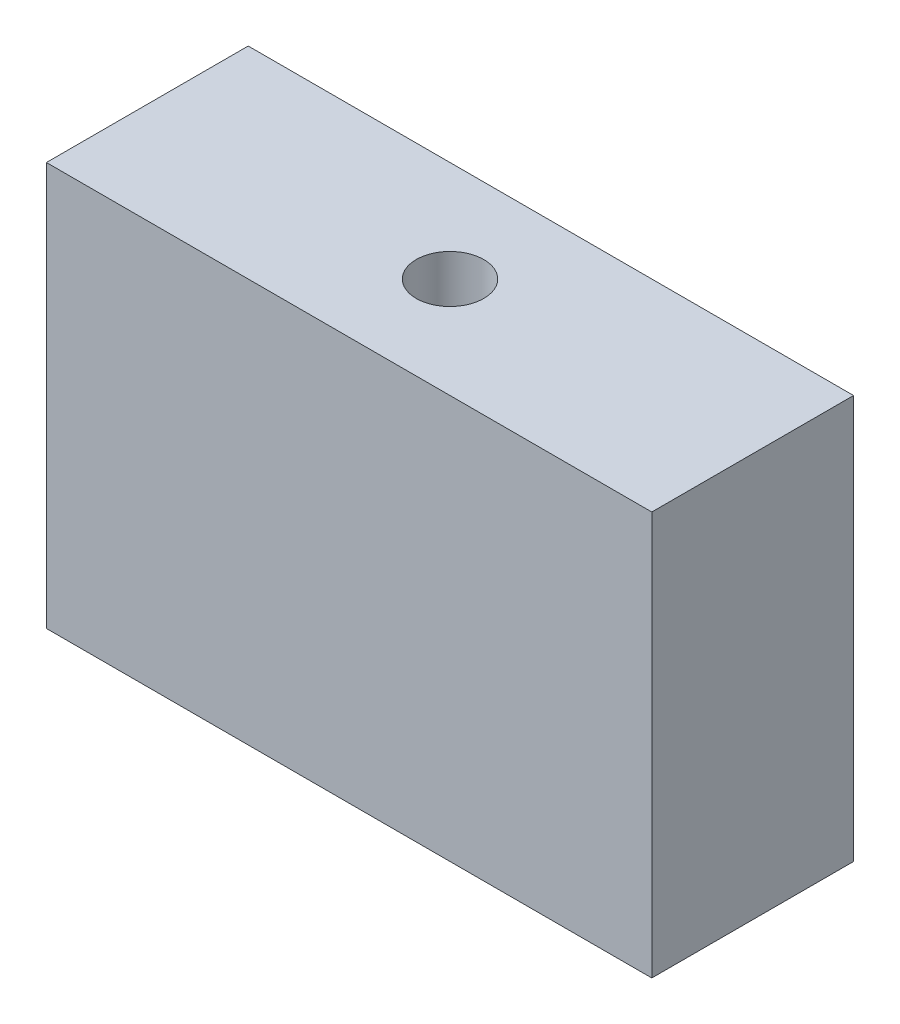
ISO-10303-21;
HEADER;
FILE_DESCRIPTION(('STEP AP214'),'2;1');
FILE_NAME('part.step','',(''),(''),'','','');
FILE_SCHEMA(('AUTOMOTIVE_DESIGN { 1 0 10303 214 1 1 1 1 }'));
ENDSEC;
DATA;
#1=APPLICATION_CONTEXT('core data for automotive mechanical design processes');
#2=APPLICATION_PROTOCOL_DEFINITION('international standard','automotive_design',2000,#1);
#3=PRODUCT_CONTEXT('',#1,'mechanical');
#4=PRODUCT('Part','Part','',(#3));
#5=PRODUCT_RELATED_PRODUCT_CATEGORY('part','',(#4));
#6=PRODUCT_DEFINITION_FORMATION('','',#4);
#7=PRODUCT_DEFINITION_CONTEXT('part definition',#1,'design');
#8=PRODUCT_DEFINITION('design','',#6,#7);
#9=PRODUCT_DEFINITION_SHAPE('','',#8);
#10=(LENGTH_UNIT() NAMED_UNIT(*) SI_UNIT(.MILLI.,.METRE.));
#11=(NAMED_UNIT(*) PLANE_ANGLE_UNIT() SI_UNIT($,.RADIAN.));
#12=(NAMED_UNIT(*) SI_UNIT($,.STERADIAN.) SOLID_ANGLE_UNIT());
#13=UNCERTAINTY_MEASURE_WITH_UNIT(LENGTH_MEASURE(1.E-05),#10,'distance_accuracy_value','');
#14=(GEOMETRIC_REPRESENTATION_CONTEXT(3) GLOBAL_UNCERTAINTY_ASSIGNED_CONTEXT((#13)) GLOBAL_UNIT_ASSIGNED_CONTEXT((#10,
#11,#12)) REPRESENTATION_CONTEXT('',''));
#15=CARTESIAN_POINT('',(0.,0.,0.));
#16=DIRECTION('',(0.,0.,1.));
#17=DIRECTION('',(1.,0.,0.));
#18=AXIS2_PLACEMENT_3D('',#15,#16,#17);
#19=CARTESIAN_POINT('',(0.,25.4,0.));
#20=DIRECTION('',(0.,1.,0.));
#21=DIRECTION('',(0.,0.,1.));
#22=AXIS2_PLACEMENT_3D('',#19,#20,#21);
#23=PLANE('',#22);
#24=DIRECTION('',(0.,0.,1.));
#25=VECTOR('',#24,1.);
#26=CARTESIAN_POINT('',(-38.1,25.4,12.7));
#27=LINE('',#26,#25);
#28=CARTESIAN_POINT('',(-38.1,25.4,-12.7));
#29=VERTEX_POINT('',#28);
#30=CARTESIAN_POINT('',(-38.1,25.4,12.7));
#31=VERTEX_POINT('',#30);
#32=EDGE_CURVE('E87',#29,#31,#27,.T.);
#33=ORIENTED_EDGE('',*,*,#32,.T.);
#34=DIRECTION('',(1.,0.,0.));
#35=VECTOR('',#34,1.);
#36=CARTESIAN_POINT('',(38.1,25.4,12.7));
#37=LINE('',#36,#35);
#38=CARTESIAN_POINT('',(38.1,25.4,12.7));
#39=VERTEX_POINT('',#38);
#40=EDGE_CURVE('E82',#31,#39,#37,.T.);
#41=ORIENTED_EDGE('',*,*,#40,.T.);
#42=DIRECTION('',(0.,0.,-1.));
#43=VECTOR('',#42,1.);
#44=CARTESIAN_POINT('',(38.1,25.4,12.7));
#45=LINE('',#44,#43);
#46=CARTESIAN_POINT('',(38.1,25.4,-12.7));
#47=VERTEX_POINT('',#46);
#48=EDGE_CURVE('E85',#39,#47,#45,.T.);
#49=ORIENTED_EDGE('',*,*,#48,.T.);
#50=DIRECTION('',(-1.,0.,0.));
#51=VECTOR('',#50,1.);
#52=CARTESIAN_POINT('',(38.1,25.4,-12.7));
#53=LINE('',#52,#51);
#54=EDGE_CURVE('E52',#47,#29,#53,.T.);
#55=ORIENTED_EDGE('',*,*,#54,.T.);
#56=EDGE_LOOP('',(#33,#41,#49,#55));
#57=FACE_BOUND('',#56,.T.);
#58=CARTESIAN_POINT('',(0.,25.4,0.));
#59=DIRECTION('',(0.,1.,0.));
#60=DIRECTION('',(0.,0.,1.));
#61=AXIS2_PLACEMENT_3D('',#58,#59,#60);
#62=CIRCLE('',#61,4.25);
#63=CARTESIAN_POINT('',(0.,25.4,4.24999999999999));
#64=VERTEX_POINT('',#63);
#65=EDGE_CURVE('E102',#64,#64,#62,.T.);
#66=ORIENTED_EDGE('',*,*,#65,.F.);
#67=EDGE_LOOP('',(#66));
#68=FACE_BOUND('',#67,.T.);
#69=ADVANCED_FACE('F35',(#57,#68),#23,.T.);
#70=CARTESIAN_POINT('',(0.,-25.4,0.));
#71=DIRECTION('',(0.,1.,0.));
#72=DIRECTION('',(0.,0.,1.));
#73=AXIS2_PLACEMENT_3D('',#70,#71,#72);
#74=PLANE('',#73);
#75=DIRECTION('',(0.,0.,1.));
#76=VECTOR('',#75,1.);
#77=CARTESIAN_POINT('',(-38.1,-25.4,12.7));
#78=LINE('',#77,#76);
#79=CARTESIAN_POINT('',(-38.1,-25.4,-12.7));
#80=VERTEX_POINT('',#79);
#81=CARTESIAN_POINT('',(-38.1,-25.4,12.7));
#82=VERTEX_POINT('',#81);
#83=EDGE_CURVE('E99',#80,#82,#78,.T.);
#84=ORIENTED_EDGE('',*,*,#83,.F.);
#85=DIRECTION('',(-1.,0.,0.));
#86=VECTOR('',#85,1.);
#87=CARTESIAN_POINT('',(38.1,-25.4,-12.7));
#88=LINE('',#87,#86);
#89=CARTESIAN_POINT('',(38.1,-25.4,-12.7));
#90=VERTEX_POINT('',#89);
#91=EDGE_CURVE('E75',#90,#80,#88,.T.);
#92=ORIENTED_EDGE('',*,*,#91,.F.);
#93=DIRECTION('',(0.,0.,-1.));
#94=VECTOR('',#93,1.);
#95=CARTESIAN_POINT('',(38.1,-25.4,12.7));
#96=LINE('',#95,#94);
#97=CARTESIAN_POINT('',(38.1,-25.4,12.7));
#98=VERTEX_POINT('',#97);
#99=EDGE_CURVE('E69',#98,#90,#96,.T.);
#100=ORIENTED_EDGE('',*,*,#99,.F.);
#101=DIRECTION('',(1.,0.,0.));
#102=VECTOR('',#101,1.);
#103=CARTESIAN_POINT('',(38.1,-25.4,12.7));
#104=LINE('',#103,#102);
#105=EDGE_CURVE('E91',#82,#98,#104,.T.);
#106=ORIENTED_EDGE('',*,*,#105,.F.);
#107=EDGE_LOOP('',(#84,#92,#100,#106));
#108=FACE_BOUND('',#107,.T.);
#109=CARTESIAN_POINT('',(0.,-25.4,0.));
#110=DIRECTION('',(0.,1.,0.));
#111=DIRECTION('',(0.,0.,1.));
#112=AXIS2_PLACEMENT_3D('',#109,#110,#111);
#113=CIRCLE('',#112,4.25);
#114=CARTESIAN_POINT('',(0.,-25.4,4.24999999999999));
#115=VERTEX_POINT('',#114);
#116=EDGE_CURVE('E114',#115,#115,#113,.T.);
#117=ORIENTED_EDGE('',*,*,#116,.T.);
#118=EDGE_LOOP('',(#117));
#119=FACE_BOUND('',#118,.T.);
#120=ADVANCED_FACE('F110',(#108,#119),#74,.F.);
#121=CARTESIAN_POINT('',(-38.1,25.4,12.7));
#122=DIRECTION('',(1.,0.,0.));
#123=DIRECTION('',(0.,0.,-1.));
#124=AXIS2_PLACEMENT_3D('',#121,#122,#123);
#125=PLANE('',#124);
#126=ORIENTED_EDGE('',*,*,#83,.T.);
#127=DIRECTION('',(0.,-1.,0.));
#128=VECTOR('',#127,1.);
#129=CARTESIAN_POINT('',(-38.1,25.4,12.7));
#130=LINE('',#129,#128);
#131=EDGE_CURVE('E11',#31,#82,#130,.T.);
#132=ORIENTED_EDGE('',*,*,#131,.F.);
#133=ORIENTED_EDGE('',*,*,#32,.F.);
#134=DIRECTION('',(0.,-1.,0.));
#135=VECTOR('',#134,1.);
#136=CARTESIAN_POINT('',(-38.1,25.4,-12.7));
#137=LINE('',#136,#135);
#138=EDGE_CURVE('E95',#29,#80,#137,.T.);
#139=ORIENTED_EDGE('',*,*,#138,.T.);
#140=EDGE_LOOP('',(#126,#132,#133,#139));
#141=FACE_BOUND('',#140,.T.);
#142=ADVANCED_FACE('F37',(#141),#125,.F.);
#143=CARTESIAN_POINT('',(38.1,25.4,12.7));
#144=DIRECTION('',(0.,0.,-1.));
#145=DIRECTION('',(-1.,0.,0.));
#146=AXIS2_PLACEMENT_3D('',#143,#144,#145);
#147=PLANE('',#146);
#148=ORIENTED_EDGE('',*,*,#105,.T.);
#149=DIRECTION('',(0.,-1.,0.));
#150=VECTOR('',#149,1.);
#151=CARTESIAN_POINT('',(38.1,25.4,12.7));
#152=LINE('',#151,#150);
#153=EDGE_CURVE('E44',#39,#98,#152,.T.);
#154=ORIENTED_EDGE('',*,*,#153,.F.);
#155=ORIENTED_EDGE('',*,*,#40,.F.);
#156=ORIENTED_EDGE('',*,*,#131,.T.);
#157=EDGE_LOOP('',(#148,#154,#155,#156));
#158=FACE_BOUND('',#157,.T.);
#159=ADVANCED_FACE('F90',(#158),#147,.F.);
#160=CARTESIAN_POINT('',(38.1,25.4,12.7));
#161=DIRECTION('',(-1.,0.,0.));
#162=DIRECTION('',(0.,0.,1.));
#163=AXIS2_PLACEMENT_3D('',#160,#161,#162);
#164=PLANE('',#163);
#165=ORIENTED_EDGE('',*,*,#99,.T.);
#166=DIRECTION('',(0.,-1.,0.));
#167=VECTOR('',#166,1.);
#168=CARTESIAN_POINT('',(38.1,25.4,-12.7));
#169=LINE('',#168,#167);
#170=EDGE_CURVE('E92',#47,#90,#169,.T.);
#171=ORIENTED_EDGE('',*,*,#170,.F.);
#172=ORIENTED_EDGE('',*,*,#48,.F.);
#173=ORIENTED_EDGE('',*,*,#153,.T.);
#174=EDGE_LOOP('',(#165,#171,#172,#173));
#175=FACE_BOUND('',#174,.T.);
#176=ADVANCED_FACE('F93',(#175),#164,.F.);
#177=CARTESIAN_POINT('',(38.1,25.4,-12.7));
#178=DIRECTION('',(0.,0.,1.));
#179=DIRECTION('',(1.,0.,0.));
#180=AXIS2_PLACEMENT_3D('',#177,#178,#179);
#181=PLANE('',#180);
#182=ORIENTED_EDGE('',*,*,#91,.T.);
#183=ORIENTED_EDGE('',*,*,#138,.F.);
#184=ORIENTED_EDGE('',*,*,#54,.F.);
#185=ORIENTED_EDGE('',*,*,#170,.T.);
#186=EDGE_LOOP('',(#182,#183,#184,#185));
#187=FACE_BOUND('',#186,.T.);
#188=ADVANCED_FACE('F107',(#187),#181,.F.);
#189=CARTESIAN_POINT('',(0.,25.4,0.));
#190=DIRECTION('',(0.,-1.,0.));
#191=DIRECTION('',(0.,0.,-1.));
#192=AXIS2_PLACEMENT_3D('',#189,#190,#191);
#193=CYLINDRICAL_SURFACE('',#192,4.25);
#194=ORIENTED_EDGE('',*,*,#65,.T.);
#195=EDGE_LOOP('',(#194));
#196=FACE_BOUND('',#195,.T.);
#197=ORIENTED_EDGE('',*,*,#116,.F.);
#198=EDGE_LOOP('',(#197));
#199=FACE_BOUND('',#198,.T.);
#200=ADVANCED_FACE('F120',(#196,#199),#193,.F.);
#201=CLOSED_SHELL('',(#69,#120,#142,#159,#176,#188,#200));
#202=MANIFOLD_SOLID_BREP('B2',#201);
#203=ADVANCED_BREP_SHAPE_REPRESENTATION('',(#18,#202),#14);
#204=SHAPE_DEFINITION_REPRESENTATION(#9,#203);
ENDSEC;
END-ISO-10303-21;
